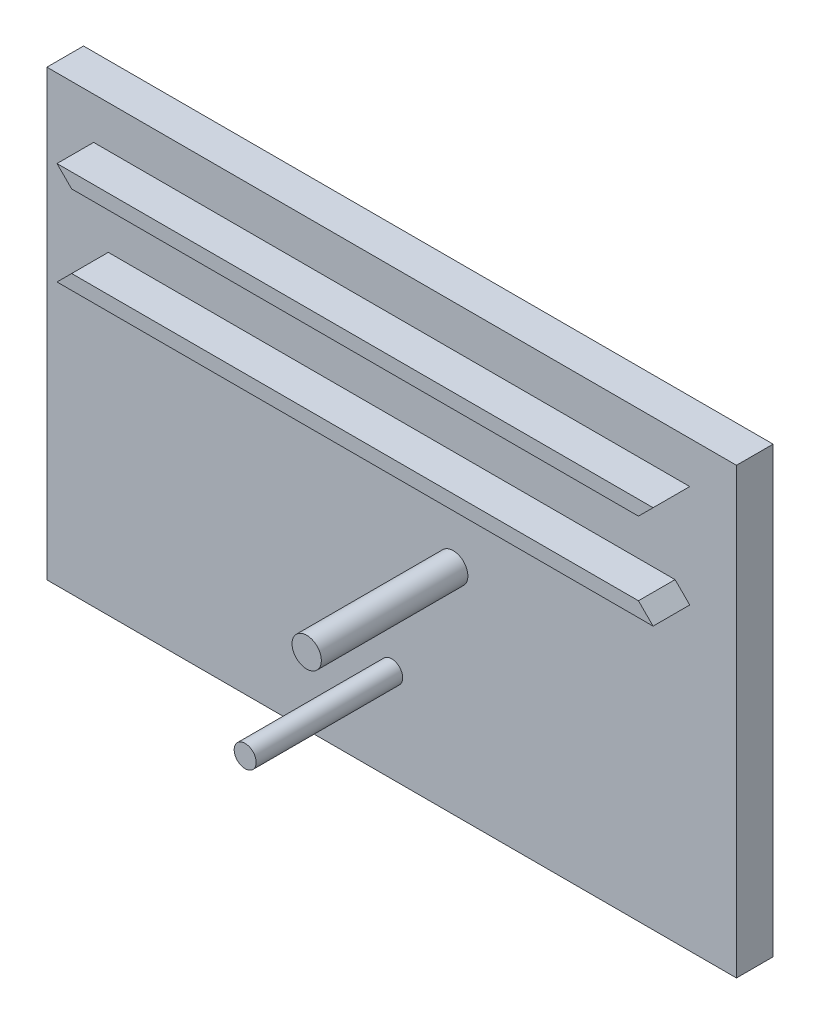
ISO-10303-21;
HEADER;
FILE_DESCRIPTION(('STEP AP214'),'2;1');
FILE_NAME('part.step','',(''),(''),'','','');
FILE_SCHEMA(('AUTOMOTIVE_DESIGN { 1 0 10303 214 1 1 1 1 }'));
ENDSEC;
DATA;
#1=APPLICATION_CONTEXT('core data for automotive mechanical design processes');
#2=APPLICATION_PROTOCOL_DEFINITION('international standard','automotive_design',2000,#1);
#3=PRODUCT_CONTEXT('',#1,'mechanical');
#4=PRODUCT('Part','Part','',(#3));
#5=PRODUCT_RELATED_PRODUCT_CATEGORY('part','',(#4));
#6=PRODUCT_DEFINITION_FORMATION('','',#4);
#7=PRODUCT_DEFINITION_CONTEXT('part definition',#1,'design');
#8=PRODUCT_DEFINITION('design','',#6,#7);
#9=PRODUCT_DEFINITION_SHAPE('','',#8);
#10=(LENGTH_UNIT() NAMED_UNIT(*) SI_UNIT(.MILLI.,.METRE.));
#11=(NAMED_UNIT(*) PLANE_ANGLE_UNIT() SI_UNIT($,.RADIAN.));
#12=(NAMED_UNIT(*) SI_UNIT($,.STERADIAN.) SOLID_ANGLE_UNIT());
#13=UNCERTAINTY_MEASURE_WITH_UNIT(LENGTH_MEASURE(1.E-05),#10,'distance_accuracy_value','');
#14=(GEOMETRIC_REPRESENTATION_CONTEXT(3) GLOBAL_UNCERTAINTY_ASSIGNED_CONTEXT((#13)) GLOBAL_UNIT_ASSIGNED_CONTEXT((#10,
#11,#12)) REPRESENTATION_CONTEXT('',''));
#15=CARTESIAN_POINT('',(0.,0.,0.));
#16=DIRECTION('',(0.,0.,1.));
#17=DIRECTION('',(1.,0.,0.));
#18=AXIS2_PLACEMENT_3D('',#15,#16,#17);
#19=CARTESIAN_POINT('',(0.,71.628,12.7));
#20=DIRECTION('',(0.,1.,0.));
#21=DIRECTION('',(0.,0.,1.));
#22=AXIS2_PLACEMENT_3D('',#19,#20,#21);
#23=PLANE('',#22);
#24=DIRECTION('',(1.,0.,0.));
#25=VECTOR('',#24,1.);
#26=CARTESIAN_POINT('',(0.,71.628,0.));
#27=LINE('',#26,#25);
#28=CARTESIAN_POINT('',(-103.331182916374,71.628,0.));
#29=VERTEX_POINT('',#28);
#30=CARTESIAN_POINT('',(103.331182916374,71.628,0.));
#31=VERTEX_POINT('',#30);
#32=EDGE_CURVE('E214',#29,#31,#27,.T.);
#33=ORIENTED_EDGE('',*,*,#32,.T.);
#34=DIRECTION('',(0.,0.,-1.));
#35=VECTOR('',#34,1.);
#36=CARTESIAN_POINT('',(103.331182916374,71.628,12.7));
#37=LINE('',#36,#35);
#38=CARTESIAN_POINT('',(103.331182916374,71.628,12.7));
#39=VERTEX_POINT('',#38);
#40=EDGE_CURVE('E12',#39,#31,#37,.T.);
#41=ORIENTED_EDGE('',*,*,#40,.F.);
#42=DIRECTION('',(1.,0.,0.));
#43=VECTOR('',#42,1.);
#44=CARTESIAN_POINT('',(0.,71.628,12.7));
#45=LINE('',#44,#43);
#46=CARTESIAN_POINT('',(-103.331182916374,71.628,12.7));
#47=VERTEX_POINT('',#46);
#48=EDGE_CURVE('E224',#47,#39,#45,.T.);
#49=ORIENTED_EDGE('',*,*,#48,.F.);
#50=DIRECTION('',(0.,0.,-1.));
#51=VECTOR('',#50,1.);
#52=CARTESIAN_POINT('',(-103.331182916374,71.628,12.7));
#53=LINE('',#52,#51);
#54=EDGE_CURVE('E240',#47,#29,#53,.T.);
#55=ORIENTED_EDGE('',*,*,#54,.T.);
#56=EDGE_LOOP('',(#33,#41,#49,#55));
#57=FACE_BOUND('',#56,.T.);
#58=ADVANCED_FACE('F56',(#57),#23,.F.);
#59=CARTESIAN_POINT('',(87.4795914581871,87.4795914581871,12.7));
#60=DIRECTION('',(-0.707106781186548,-0.707106781186548,0.));
#61=DIRECTION('',(0.707106781186548,-0.707106781186548,0.));
#62=AXIS2_PLACEMENT_3D('',#59,#60,#61);
#63=PLANE('',#62);
#64=DIRECTION('',(-0.707106781186548,0.707106781186548,0.));
#65=VECTOR('',#64,1.);
#66=CARTESIAN_POINT('',(87.4795914581871,87.4795914581871,0.));
#67=LINE('',#66,#65);
#68=CARTESIAN_POINT('',(98.2511829163743,76.708,0.));
#69=VERTEX_POINT('',#68);
#70=EDGE_CURVE('E244',#31,#69,#67,.T.);
#71=ORIENTED_EDGE('',*,*,#70,.T.);
#72=DIRECTION('',(0.,0.,-1.));
#73=VECTOR('',#72,1.);
#74=CARTESIAN_POINT('',(98.2511829163743,76.708,12.7));
#75=LINE('',#74,#73);
#76=CARTESIAN_POINT('',(98.2511829163743,76.708,12.7));
#77=VERTEX_POINT('',#76);
#78=EDGE_CURVE('E64',#77,#69,#75,.T.);
#79=ORIENTED_EDGE('',*,*,#78,.F.);
#80=DIRECTION('',(-0.707106781186548,0.707106781186548,0.));
#81=VECTOR('',#80,1.);
#82=CARTESIAN_POINT('',(87.4795914581871,87.4795914581871,12.7));
#83=LINE('',#82,#81);
#84=EDGE_CURVE('E228',#39,#77,#83,.T.);
#85=ORIENTED_EDGE('',*,*,#84,.F.);
#86=ORIENTED_EDGE('',*,*,#40,.T.);
#87=EDGE_LOOP('',(#71,#79,#85,#86));
#88=FACE_BOUND('',#87,.T.);
#89=ADVANCED_FACE('F267',(#88),#63,.F.);
#90=CARTESIAN_POINT('',(0.,76.708,12.7));
#91=DIRECTION('',(0.,1.,0.));
#92=DIRECTION('',(0.,0.,1.));
#93=AXIS2_PLACEMENT_3D('',#90,#91,#92);
#94=PLANE('',#93);
#95=DIRECTION('',(1.,0.,0.));
#96=VECTOR('',#95,1.);
#97=CARTESIAN_POINT('',(0.,76.708,0.));
#98=LINE('',#97,#96);
#99=CARTESIAN_POINT('',(-98.2511829163745,76.708,0.));
#100=VERTEX_POINT('',#99);
#101=EDGE_CURVE('E248',#100,#69,#98,.T.);
#102=ORIENTED_EDGE('',*,*,#101,.F.);
#103=DIRECTION('',(0.,0.,-1.));
#104=VECTOR('',#103,1.);
#105=CARTESIAN_POINT('',(-98.2511829163745,76.708,12.7));
#106=LINE('',#105,#104);
#107=CARTESIAN_POINT('',(-98.2511829163745,76.708,12.7));
#108=VERTEX_POINT('',#107);
#109=EDGE_CURVE('E256',#108,#100,#106,.T.);
#110=ORIENTED_EDGE('',*,*,#109,.F.);
#111=DIRECTION('',(1.,0.,0.));
#112=VECTOR('',#111,1.);
#113=CARTESIAN_POINT('',(0.,76.708,12.7));
#114=LINE('',#113,#112);
#115=EDGE_CURVE('E232',#108,#77,#114,.T.);
#116=ORIENTED_EDGE('',*,*,#115,.T.);
#117=ORIENTED_EDGE('',*,*,#78,.T.);
#118=EDGE_LOOP('',(#102,#110,#116,#117));
#119=FACE_BOUND('',#118,.T.);
#120=ADVANCED_FACE('F264',(#119),#94,.T.);
#121=CARTESIAN_POINT('',(-87.4795914581872,87.4795914581872,12.7));
#122=DIRECTION('',(-0.707106781186548,0.707106781186548,0.));
#123=DIRECTION('',(-0.707106781186548,-0.707106781186548,0.));
#124=AXIS2_PLACEMENT_3D('',#121,#122,#123);
#125=PLANE('',#124);
#126=DIRECTION('',(0.707106781186548,0.707106781186548,0.));
#127=VECTOR('',#126,1.);
#128=CARTESIAN_POINT('',(-87.4795914581872,87.4795914581872,0.));
#129=LINE('',#128,#127);
#130=EDGE_CURVE('E229',#29,#100,#129,.T.);
#131=ORIENTED_EDGE('',*,*,#130,.F.);
#132=ORIENTED_EDGE('',*,*,#54,.F.);
#133=DIRECTION('',(0.707106781186548,0.707106781186548,0.));
#134=VECTOR('',#133,1.);
#135=CARTESIAN_POINT('',(-87.4795914581872,87.4795914581872,12.7));
#136=LINE('',#135,#134);
#137=EDGE_CURVE('E236',#47,#108,#136,.T.);
#138=ORIENTED_EDGE('',*,*,#137,.T.);
#139=ORIENTED_EDGE('',*,*,#109,.T.);
#140=EDGE_LOOP('',(#131,#132,#138,#139));
#141=FACE_BOUND('',#140,.T.);
#142=ADVANCED_FACE('F272',(#141),#125,.T.);
#143=CARTESIAN_POINT('',(0.,0.,12.7));
#144=DIRECTION('',(0.,0.,1.));
#145=DIRECTION('',(1.,0.,0.));
#146=AXIS2_PLACEMENT_3D('',#143,#144,#145);
#147=PLANE('',#146);
#148=ORIENTED_EDGE('',*,*,#48,.T.);
#149=ORIENTED_EDGE('',*,*,#84,.T.);
#150=ORIENTED_EDGE('',*,*,#115,.F.);
#151=ORIENTED_EDGE('',*,*,#137,.F.);
#152=EDGE_LOOP('',(#148,#149,#150,#151));
#153=FACE_BOUND('',#152,.T.);
#154=ADVANCED_FACE('F275',(#153),#147,.T.);
#155=CARTESIAN_POINT('',(0.,0.,0.));
#156=DIRECTION('',(0.,0.,1.));
#157=DIRECTION('',(1.,0.,0.));
#158=AXIS2_PLACEMENT_3D('',#155,#156,#157);
#159=PLANE('',#158);
#160=CARTESIAN_POINT('',(0.,0.,0.));
#161=DIRECTION('',(0.,0.,1.));
#162=DIRECTION('',(1.,0.,0.));
#163=AXIS2_PLACEMENT_3D('',#160,#161,#162);
#164=CIRCLE('',#163,3.81);
#165=CARTESIAN_POINT('',(3.81,0.,0.));
#166=VERTEX_POINT('',#165);
#167=EDGE_CURVE('E353',#166,#166,#164,.T.);
#168=ORIENTED_EDGE('',*,*,#167,.F.);
#169=EDGE_LOOP('',(#168));
#170=FACE_BOUND('',#169,.T.);
#171=CARTESIAN_POINT('',(21.3330135827612,41.8683965716115,0.));
#172=DIRECTION('',(0.,0.,1.));
#173=DIRECTION('',(1.,0.,0.));
#174=AXIS2_PLACEMENT_3D('',#171,#172,#173);
#175=CIRCLE('',#174,5.08);
#176=CARTESIAN_POINT('',(26.4130135827612,41.8683965716115,0.));
#177=VERTEX_POINT('',#176);
#178=EDGE_CURVE('E355',#177,#177,#175,.T.);
#179=ORIENTED_EDGE('',*,*,#178,.F.);
#180=EDGE_LOOP('',(#179));
#181=FACE_BOUND('',#180,.T.);
#182=DIRECTION('',(1.,0.,0.));
#183=VECTOR('',#182,1.);
#184=CARTESIAN_POINT('',(-103.331182916374,107.188,0.));
#185=LINE('',#184,#183);
#186=CARTESIAN_POINT('',(-103.331182916374,107.188,0.));
#187=VERTEX_POINT('',#186);
#188=CARTESIAN_POINT('',(103.331182916374,107.188,0.));
#189=VERTEX_POINT('',#188);
#190=EDGE_CURVE('E141',#187,#189,#185,.T.);
#191=ORIENTED_EDGE('',*,*,#190,.T.);
#192=DIRECTION('',(-0.707106781186548,-0.707106781186548,0.));
#193=VECTOR('',#192,1.);
#194=CARTESIAN_POINT('',(103.331182916374,107.188,0.));
#195=LINE('',#194,#193);
#196=CARTESIAN_POINT('',(98.2511829163743,102.108,0.));
#197=VERTEX_POINT('',#196);
#198=EDGE_CURVE('E146',#189,#197,#195,.T.);
#199=ORIENTED_EDGE('',*,*,#198,.T.);
#200=DIRECTION('',(1.,0.,0.));
#201=VECTOR('',#200,1.);
#202=CARTESIAN_POINT('',(-98.2511829163745,102.108,0.));
#203=LINE('',#202,#201);
#204=CARTESIAN_POINT('',(-98.2511829163745,102.108,0.));
#205=VERTEX_POINT('',#204);
#206=EDGE_CURVE('E76',#205,#197,#203,.T.);
#207=ORIENTED_EDGE('',*,*,#206,.F.);
#208=DIRECTION('',(0.707106781186548,-0.707106781186548,0.));
#209=VECTOR('',#208,1.);
#210=CARTESIAN_POINT('',(-103.331182916374,107.188,0.));
#211=LINE('',#210,#209);
#212=EDGE_CURVE('E71',#187,#205,#211,.T.);
#213=ORIENTED_EDGE('',*,*,#212,.F.);
#214=EDGE_LOOP('',(#191,#199,#207,#213));
#215=FACE_BOUND('',#214,.T.);
#216=DIRECTION('',(0.,-1.,0.));
#217=VECTOR('',#216,1.);
#218=CARTESIAN_POINT('',(119.53218833591,0.,0.));
#219=LINE('',#218,#217);
#220=CARTESIAN_POINT('',(119.53218833591,121.674149154879,0.));
#221=VERTEX_POINT('',#220);
#222=CARTESIAN_POINT('',(119.53218833591,-32.2661491548786,0.));
#223=VERTEX_POINT('',#222);
#224=EDGE_CURVE('E150',#221,#223,#219,.T.);
#225=ORIENTED_EDGE('',*,*,#224,.F.);
#226=DIRECTION('',(1.,0.,0.));
#227=VECTOR('',#226,1.);
#228=CARTESIAN_POINT('',(0.,121.674149154879,0.));
#229=LINE('',#228,#227);
#230=CARTESIAN_POINT('',(-119.53218833591,121.674149154879,0.));
#231=VERTEX_POINT('',#230);
#232=EDGE_CURVE('E201',#231,#221,#229,.T.);
#233=ORIENTED_EDGE('',*,*,#232,.F.);
#234=DIRECTION('',(0.,-1.,0.));
#235=VECTOR('',#234,1.);
#236=CARTESIAN_POINT('',(-119.53218833591,0.,0.));
#237=LINE('',#236,#235);
#238=CARTESIAN_POINT('',(-119.53218833591,-32.2661491548786,0.));
#239=VERTEX_POINT('',#238);
#240=EDGE_CURVE('E204',#231,#239,#237,.T.);
#241=ORIENTED_EDGE('',*,*,#240,.T.);
#242=DIRECTION('',(1.,0.,0.));
#243=VECTOR('',#242,1.);
#244=CARTESIAN_POINT('',(0.,-32.2661491548786,0.));
#245=LINE('',#244,#243);
#246=EDGE_CURVE('E186',#239,#223,#245,.T.);
#247=ORIENTED_EDGE('',*,*,#246,.T.);
#248=EDGE_LOOP('',(#225,#233,#241,#247));
#249=FACE_BOUND('',#248,.T.);
#250=ORIENTED_EDGE('',*,*,#32,.F.);
#251=ORIENTED_EDGE('',*,*,#130,.T.);
#252=ORIENTED_EDGE('',*,*,#101,.T.);
#253=ORIENTED_EDGE('',*,*,#70,.F.);
#254=EDGE_LOOP('',(#250,#251,#252,#253));
#255=FACE_BOUND('',#254,.T.);
#256=ADVANCED_FACE('F143',(#170,#181,#215,#249,#255),#159,.T.);
#257=CARTESIAN_POINT('',(119.53218833591,0.,-12.7));
#258=DIRECTION('',(-1.,0.,0.));
#259=DIRECTION('',(0.,0.,1.));
#260=AXIS2_PLACEMENT_3D('',#257,#258,#259);
#261=PLANE('',#260);
#262=ORIENTED_EDGE('',*,*,#224,.T.);
#263=DIRECTION('',(0.,0.,1.));
#264=VECTOR('',#263,1.);
#265=CARTESIAN_POINT('',(119.53218833591,-32.2661491548786,-12.7));
#266=LINE('',#265,#264);
#267=CARTESIAN_POINT('',(119.53218833591,-32.2661491548786,-12.7));
#268=VERTEX_POINT('',#267);
#269=EDGE_CURVE('E211',#268,#223,#266,.T.);
#270=ORIENTED_EDGE('',*,*,#269,.F.);
#271=DIRECTION('',(0.,-1.,0.));
#272=VECTOR('',#271,1.);
#273=CARTESIAN_POINT('',(119.53218833591,0.,-12.7));
#274=LINE('',#273,#272);
#275=CARTESIAN_POINT('',(119.53218833591,121.674149154879,-12.7));
#276=VERTEX_POINT('',#275);
#277=EDGE_CURVE('E182',#276,#268,#274,.T.);
#278=ORIENTED_EDGE('',*,*,#277,.F.);
#279=DIRECTION('',(0.,0.,1.));
#280=VECTOR('',#279,1.);
#281=CARTESIAN_POINT('',(119.53218833591,121.674149154879,-12.7));
#282=LINE('',#281,#280);
#283=EDGE_CURVE('E197',#276,#221,#282,.T.);
#284=ORIENTED_EDGE('',*,*,#283,.T.);
#285=EDGE_LOOP('',(#262,#270,#278,#284));
#286=FACE_BOUND('',#285,.T.);
#287=ADVANCED_FACE('F291',(#286),#261,.F.);
#288=CARTESIAN_POINT('',(0.,-32.2661491548786,-12.7));
#289=DIRECTION('',(0.,-1.,0.));
#290=DIRECTION('',(0.,0.,-1.));
#291=AXIS2_PLACEMENT_3D('',#288,#289,#290);
#292=PLANE('',#291);
#293=ORIENTED_EDGE('',*,*,#246,.F.);
#294=DIRECTION('',(0.,0.,1.));
#295=VECTOR('',#294,1.);
#296=CARTESIAN_POINT('',(-119.53218833591,-32.2661491548786,-12.7));
#297=LINE('',#296,#295);
#298=CARTESIAN_POINT('',(-119.53218833591,-32.2661491548786,-12.7));
#299=VERTEX_POINT('',#298);
#300=EDGE_CURVE('E215',#299,#239,#297,.T.);
#301=ORIENTED_EDGE('',*,*,#300,.F.);
#302=DIRECTION('',(1.,0.,0.));
#303=VECTOR('',#302,1.);
#304=CARTESIAN_POINT('',(0.,-32.2661491548786,-12.7));
#305=LINE('',#304,#303);
#306=EDGE_CURVE('E193',#299,#268,#305,.T.);
#307=ORIENTED_EDGE('',*,*,#306,.T.);
#308=ORIENTED_EDGE('',*,*,#269,.T.);
#309=EDGE_LOOP('',(#293,#301,#307,#308));
#310=FACE_BOUND('',#309,.T.);
#311=ADVANCED_FACE('F294',(#310),#292,.T.);
#312=CARTESIAN_POINT('',(-119.53218833591,0.,-12.7));
#313=DIRECTION('',(-1.,0.,0.));
#314=DIRECTION('',(0.,0.,1.));
#315=AXIS2_PLACEMENT_3D('',#312,#313,#314);
#316=PLANE('',#315);
#317=ORIENTED_EDGE('',*,*,#240,.F.);
#318=DIRECTION('',(0.,0.,1.));
#319=VECTOR('',#318,1.);
#320=CARTESIAN_POINT('',(-119.53218833591,121.674149154879,-12.7));
#321=LINE('',#320,#319);
#322=CARTESIAN_POINT('',(-119.53218833591,121.674149154879,-12.7));
#323=VERTEX_POINT('',#322);
#324=EDGE_CURVE('E218',#323,#231,#321,.T.);
#325=ORIENTED_EDGE('',*,*,#324,.F.);
#326=DIRECTION('',(0.,-1.,0.));
#327=VECTOR('',#326,1.);
#328=CARTESIAN_POINT('',(-119.53218833591,0.,-12.7));
#329=LINE('',#328,#327);
#330=EDGE_CURVE('E189',#323,#299,#329,.T.);
#331=ORIENTED_EDGE('',*,*,#330,.T.);
#332=ORIENTED_EDGE('',*,*,#300,.T.);
#333=EDGE_LOOP('',(#317,#325,#331,#332));
#334=FACE_BOUND('',#333,.T.);
#335=ADVANCED_FACE('F300',(#334),#316,.T.);
#336=CARTESIAN_POINT('',(0.,121.674149154879,-12.7));
#337=DIRECTION('',(0.,-1.,0.));
#338=DIRECTION('',(0.,0.,-1.));
#339=AXIS2_PLACEMENT_3D('',#336,#337,#338);
#340=PLANE('',#339);
#341=ORIENTED_EDGE('',*,*,#232,.T.);
#342=ORIENTED_EDGE('',*,*,#283,.F.);
#343=DIRECTION('',(1.,0.,0.));
#344=VECTOR('',#343,1.);
#345=CARTESIAN_POINT('',(0.,121.674149154879,-12.7));
#346=LINE('',#345,#344);
#347=EDGE_CURVE('E185',#323,#276,#346,.T.);
#348=ORIENTED_EDGE('',*,*,#347,.F.);
#349=ORIENTED_EDGE('',*,*,#324,.T.);
#350=EDGE_LOOP('',(#341,#342,#348,#349));
#351=FACE_BOUND('',#350,.T.);
#352=ADVANCED_FACE('F296',(#351),#340,.F.);
#353=CARTESIAN_POINT('',(0.,0.,-12.7));
#354=DIRECTION('',(0.,0.,1.));
#355=DIRECTION('',(1.,0.,0.));
#356=AXIS2_PLACEMENT_3D('',#353,#354,#355);
#357=PLANE('',#356);
#358=ORIENTED_EDGE('',*,*,#277,.T.);
#359=ORIENTED_EDGE('',*,*,#306,.F.);
#360=ORIENTED_EDGE('',*,*,#330,.F.);
#361=ORIENTED_EDGE('',*,*,#347,.T.);
#362=EDGE_LOOP('',(#358,#359,#360,#361));
#363=FACE_BOUND('',#362,.T.);
#364=ADVANCED_FACE('F299',(#363),#357,.F.);
#365=CARTESIAN_POINT('',(-103.331182916374,107.188,12.7));
#366=DIRECTION('',(0.,1.,0.));
#367=DIRECTION('',(0.,0.,1.));
#368=AXIS2_PLACEMENT_3D('',#365,#366,#367);
#369=PLANE('',#368);
#370=ORIENTED_EDGE('',*,*,#190,.F.);
#371=DIRECTION('',(0.,0.,-1.));
#372=VECTOR('',#371,1.);
#373=CARTESIAN_POINT('',(-103.331182916374,107.188,12.7));
#374=LINE('',#373,#372);
#375=CARTESIAN_POINT('',(-103.331182916374,107.188,12.7));
#376=VERTEX_POINT('',#375);
#377=EDGE_CURVE('E366',#376,#187,#374,.T.);
#378=ORIENTED_EDGE('',*,*,#377,.F.);
#379=DIRECTION('',(1.,0.,0.));
#380=VECTOR('',#379,1.);
#381=CARTESIAN_POINT('',(-103.331182916374,107.188,12.7));
#382=LINE('',#381,#380);
#383=CARTESIAN_POINT('',(103.331182916374,107.188,12.7));
#384=VERTEX_POINT('',#383);
#385=EDGE_CURVE('E156',#376,#384,#382,.T.);
#386=ORIENTED_EDGE('',*,*,#385,.T.);
#387=DIRECTION('',(0.,0.,-1.));
#388=VECTOR('',#387,1.);
#389=CARTESIAN_POINT('',(103.331182916374,107.188,12.7));
#390=LINE('',#389,#388);
#391=EDGE_CURVE('E153',#384,#189,#390,.T.);
#392=ORIENTED_EDGE('',*,*,#391,.T.);
#393=EDGE_LOOP('',(#370,#378,#386,#392));
#394=FACE_BOUND('',#393,.T.);
#395=ADVANCED_FACE('F154',(#394),#369,.T.);
#396=CARTESIAN_POINT('',(-103.331182916374,107.188,12.7));
#397=DIRECTION('',(0.707106781186548,0.707106781186548,0.));
#398=DIRECTION('',(-0.707106781186548,0.707106781186548,0.));
#399=AXIS2_PLACEMENT_3D('',#396,#397,#398);
#400=PLANE('',#399);
#401=ORIENTED_EDGE('',*,*,#212,.T.);
#402=DIRECTION('',(0.,0.,-1.));
#403=VECTOR('',#402,1.);
#404=CARTESIAN_POINT('',(-98.2511829163745,102.108,12.7));
#405=LINE('',#404,#403);
#406=CARTESIAN_POINT('',(-98.2511829163745,102.108,12.7));
#407=VERTEX_POINT('',#406);
#408=EDGE_CURVE('E370',#407,#205,#405,.T.);
#409=ORIENTED_EDGE('',*,*,#408,.F.);
#410=DIRECTION('',(0.707106781186548,-0.707106781186548,0.));
#411=VECTOR('',#410,1.);
#412=CARTESIAN_POINT('',(-103.331182916374,107.188,12.7));
#413=LINE('',#412,#411);
#414=EDGE_CURVE('E161',#376,#407,#413,.T.);
#415=ORIENTED_EDGE('',*,*,#414,.F.);
#416=ORIENTED_EDGE('',*,*,#377,.T.);
#417=EDGE_LOOP('',(#401,#409,#415,#416));
#418=FACE_BOUND('',#417,.T.);
#419=ADVANCED_FACE('F319',(#418),#400,.F.);
#420=CARTESIAN_POINT('',(-98.2511829163745,102.108,12.7));
#421=DIRECTION('',(0.,1.,0.));
#422=DIRECTION('',(0.,0.,1.));
#423=AXIS2_PLACEMENT_3D('',#420,#421,#422);
#424=PLANE('',#423);
#425=ORIENTED_EDGE('',*,*,#206,.T.);
#426=DIRECTION('',(0.,0.,-1.));
#427=VECTOR('',#426,1.);
#428=CARTESIAN_POINT('',(98.2511829163743,102.108,12.7));
#429=LINE('',#428,#427);
#430=CARTESIAN_POINT('',(98.2511829163743,102.108,12.7));
#431=VERTEX_POINT('',#430);
#432=EDGE_CURVE('E162',#431,#197,#429,.T.);
#433=ORIENTED_EDGE('',*,*,#432,.F.);
#434=DIRECTION('',(1.,0.,0.));
#435=VECTOR('',#434,1.);
#436=CARTESIAN_POINT('',(-98.2511829163745,102.108,12.7));
#437=LINE('',#436,#435);
#438=EDGE_CURVE('E174',#407,#431,#437,.T.);
#439=ORIENTED_EDGE('',*,*,#438,.F.);
#440=ORIENTED_EDGE('',*,*,#408,.T.);
#441=EDGE_LOOP('',(#425,#433,#439,#440));
#442=FACE_BOUND('',#441,.T.);
#443=ADVANCED_FACE('F322',(#442),#424,.F.);
#444=CARTESIAN_POINT('',(103.331182916374,107.188,12.7));
#445=DIRECTION('',(0.707106781186548,-0.707106781186548,0.));
#446=DIRECTION('',(0.707106781186548,0.707106781186548,0.));
#447=AXIS2_PLACEMENT_3D('',#444,#445,#446);
#448=PLANE('',#447);
#449=ORIENTED_EDGE('',*,*,#198,.F.);
#450=ORIENTED_EDGE('',*,*,#391,.F.);
#451=DIRECTION('',(-0.707106781186548,-0.707106781186548,0.));
#452=VECTOR('',#451,1.);
#453=CARTESIAN_POINT('',(103.331182916374,107.188,12.7));
#454=LINE('',#453,#452);
#455=EDGE_CURVE('E177',#384,#431,#454,.T.);
#456=ORIENTED_EDGE('',*,*,#455,.T.);
#457=ORIENTED_EDGE('',*,*,#432,.T.);
#458=EDGE_LOOP('',(#449,#450,#456,#457));
#459=FACE_BOUND('',#458,.T.);
#460=ADVANCED_FACE('F164',(#459),#448,.T.);
#461=CARTESIAN_POINT('',(0.,0.,12.7));
#462=DIRECTION('',(0.,0.,-1.));
#463=DIRECTION('',(-1.,0.,0.));
#464=AXIS2_PLACEMENT_3D('',#461,#462,#463);
#465=PLANE('',#464);
#466=ORIENTED_EDGE('',*,*,#385,.F.);
#467=ORIENTED_EDGE('',*,*,#414,.T.);
#468=ORIENTED_EDGE('',*,*,#438,.T.);
#469=ORIENTED_EDGE('',*,*,#455,.F.);
#470=EDGE_LOOP('',(#466,#467,#468,#469));
#471=FACE_BOUND('',#470,.T.);
#472=ADVANCED_FACE('F314',(#471),#465,.F.);
#473=CARTESIAN_POINT('',(21.3330135827612,41.8683965716115,50.8));
#474=DIRECTION('',(0.,0.,-1.));
#475=DIRECTION('',(-1.,0.,0.));
#476=AXIS2_PLACEMENT_3D('',#473,#474,#475);
#477=CYLINDRICAL_SURFACE('',#476,5.08);
#478=CARTESIAN_POINT('',(21.3330135827612,41.8683965716115,50.8));
#479=DIRECTION('',(0.,0.,1.));
#480=DIRECTION('',(1.,0.,0.));
#481=AXIS2_PLACEMENT_3D('',#478,#479,#480);
#482=CIRCLE('',#481,5.08);
#483=CARTESIAN_POINT('',(26.4130135827612,41.8683965716115,50.8));
#484=VERTEX_POINT('',#483);
#485=EDGE_CURVE('E360',#484,#484,#482,.T.);
#486=ORIENTED_EDGE('',*,*,#485,.F.);
#487=EDGE_LOOP('',(#486));
#488=FACE_BOUND('',#487,.T.);
#489=ORIENTED_EDGE('',*,*,#178,.T.);
#490=EDGE_LOOP('',(#489));
#491=FACE_BOUND('',#490,.T.);
#492=ADVANCED_FACE('F317',(#488,#491),#477,.T.);
#493=CARTESIAN_POINT('',(0.,0.,50.8));
#494=DIRECTION('',(0.,0.,1.));
#495=DIRECTION('',(1.,0.,0.));
#496=AXIS2_PLACEMENT_3D('',#493,#494,#495);
#497=PLANE('',#496);
#498=ORIENTED_EDGE('',*,*,#485,.T.);
#499=EDGE_LOOP('',(#498));
#500=FACE_BOUND('',#499,.T.);
#501=ADVANCED_FACE('F333',(#500),#497,.T.);
#502=CARTESIAN_POINT('',(0.,0.,50.8));
#503=DIRECTION('',(0.,0.,-1.));
#504=DIRECTION('',(-1.,0.,0.));
#505=AXIS2_PLACEMENT_3D('',#502,#503,#504);
#506=CYLINDRICAL_SURFACE('',#505,3.81);
#507=CARTESIAN_POINT('',(0.,0.,50.8));
#508=DIRECTION('',(0.,0.,1.));
#509=DIRECTION('',(1.,0.,0.));
#510=AXIS2_PLACEMENT_3D('',#507,#508,#509);
#511=CIRCLE('',#510,3.81);
#512=CARTESIAN_POINT('',(3.81,0.,50.8));
#513=VERTEX_POINT('',#512);
#514=EDGE_CURVE('E350',#513,#513,#511,.T.);
#515=ORIENTED_EDGE('',*,*,#514,.F.);
#516=EDGE_LOOP('',(#515));
#517=FACE_BOUND('',#516,.T.);
#518=ORIENTED_EDGE('',*,*,#167,.T.);
#519=EDGE_LOOP('',(#518));
#520=FACE_BOUND('',#519,.T.);
#521=ADVANCED_FACE('F337',(#517,#520),#506,.T.);
#522=CARTESIAN_POINT('',(0.,0.,50.8));
#523=DIRECTION('',(0.,0.,1.));
#524=DIRECTION('',(1.,0.,0.));
#525=AXIS2_PLACEMENT_3D('',#522,#523,#524);
#526=PLANE('',#525);
#527=ORIENTED_EDGE('',*,*,#514,.T.);
#528=EDGE_LOOP('',(#527));
#529=FACE_BOUND('',#528,.T.);
#530=ADVANCED_FACE('F339',(#529),#526,.T.);
#531=CLOSED_SHELL('',(#58,#89,#120,#142,#154,#256,#287,#311,#335,#352,#364,#395,#419,#443,#460,
#472,#492,#501,#521,#530));
#532=MANIFOLD_SOLID_BREP('B2',#531);
#533=ADVANCED_BREP_SHAPE_REPRESENTATION('',(#18,#532),#14);
#534=SHAPE_DEFINITION_REPRESENTATION(#9,#533);
ENDSEC;
END-ISO-10303-21;
